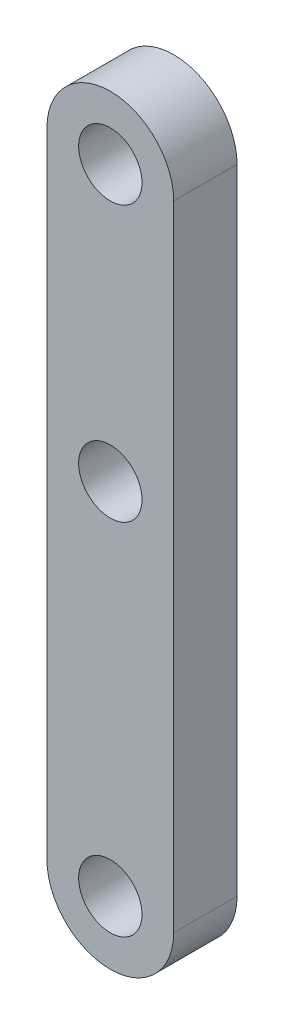
ISO-10303-21;
HEADER;
FILE_DESCRIPTION(('STEP AP214'),'2;1');
FILE_NAME('part.step','',(''),(''),'','','');
FILE_SCHEMA(('AUTOMOTIVE_DESIGN { 1 0 10303 214 1 1 1 1 }'));
ENDSEC;
DATA;
#1=APPLICATION_CONTEXT('core data for automotive mechanical design processes');
#2=APPLICATION_PROTOCOL_DEFINITION('international standard','automotive_design',2000,#1);
#3=PRODUCT_CONTEXT('',#1,'mechanical');
#4=PRODUCT('Part','Part','',(#3));
#5=PRODUCT_RELATED_PRODUCT_CATEGORY('part','',(#4));
#6=PRODUCT_DEFINITION_FORMATION('','',#4);
#7=PRODUCT_DEFINITION_CONTEXT('part definition',#1,'design');
#8=PRODUCT_DEFINITION('design','',#6,#7);
#9=PRODUCT_DEFINITION_SHAPE('','',#8);
#10=(LENGTH_UNIT() NAMED_UNIT(*) SI_UNIT(.MILLI.,.METRE.));
#11=(NAMED_UNIT(*) PLANE_ANGLE_UNIT() SI_UNIT($,.RADIAN.));
#12=(NAMED_UNIT(*) SI_UNIT($,.STERADIAN.) SOLID_ANGLE_UNIT());
#13=UNCERTAINTY_MEASURE_WITH_UNIT(LENGTH_MEASURE(1.E-05),#10,'distance_accuracy_value','');
#14=(GEOMETRIC_REPRESENTATION_CONTEXT(3) GLOBAL_UNCERTAINTY_ASSIGNED_CONTEXT((#13)) GLOBAL_UNIT_ASSIGNED_CONTEXT((#10,
#11,#12)) REPRESENTATION_CONTEXT('',''));
#15=CARTESIAN_POINT('',(0.,0.,0.));
#16=DIRECTION('',(0.,0.,1.));
#17=DIRECTION('',(1.,0.,0.));
#18=AXIS2_PLACEMENT_3D('',#15,#16,#17);
#19=CARTESIAN_POINT('',(0.,-30.,3.));
#20=DIRECTION('',(0.,0.,-1.));
#21=DIRECTION('',(-1.,0.,0.));
#22=AXIS2_PLACEMENT_3D('',#19,#20,#21);
#23=PLANE('',#22);
#24=DIRECTION('',(0.,1.,0.));
#25=VECTOR('',#24,1.);
#26=CARTESIAN_POINT('',(3.,-8.,3.));
#27=LINE('',#26,#25);
#28=CARTESIAN_POINT('',(3.,-30.,3.));
#29=VERTEX_POINT('',#28);
#30=CARTESIAN_POINT('',(3.,0.,3.));
#31=VERTEX_POINT('',#30);
#32=EDGE_CURVE('E50',#29,#31,#27,.T.);
#33=ORIENTED_EDGE('',*,*,#32,.T.);
#34=CARTESIAN_POINT('',(0.,0.,3.));
#35=DIRECTION('',(0.,0.,1.));
#36=DIRECTION('',(1.,0.,0.));
#37=AXIS2_PLACEMENT_3D('',#34,#35,#36);
#38=CIRCLE('',#37,3.);
#39=CARTESIAN_POINT('',(-3.,0.,3.));
#40=VERTEX_POINT('',#39);
#41=EDGE_CURVE('E80',#31,#40,#38,.T.);
#42=ORIENTED_EDGE('',*,*,#41,.T.);
#43=DIRECTION('',(0.,-1.,0.));
#44=VECTOR('',#43,1.);
#45=CARTESIAN_POINT('',(-3.,0.,3.));
#46=LINE('',#45,#44);
#47=CARTESIAN_POINT('',(-3.,-30.,3.));
#48=VERTEX_POINT('',#47);
#49=EDGE_CURVE('E84',#40,#48,#46,.T.);
#50=ORIENTED_EDGE('',*,*,#49,.T.);
#51=CARTESIAN_POINT('',(0.,-30.,3.));
#52=DIRECTION('',(0.,0.,1.));
#53=DIRECTION('',(-1.,0.,0.));
#54=AXIS2_PLACEMENT_3D('',#51,#52,#53);
#55=CIRCLE('',#54,3.);
#56=EDGE_CURVE('E92',#48,#29,#55,.T.);
#57=ORIENTED_EDGE('',*,*,#56,.T.);
#58=EDGE_LOOP('',(#33,#42,#50,#57));
#59=FACE_BOUND('',#58,.T.);
#60=CARTESIAN_POINT('',(0.,0.,3.));
#61=DIRECTION('',(0.,0.,1.));
#62=DIRECTION('',(1.,0.,0.));
#63=AXIS2_PLACEMENT_3D('',#60,#61,#62);
#64=CIRCLE('',#63,1.5);
#65=CARTESIAN_POINT('',(1.5,0.,3.));
#66=VERTEX_POINT('',#65);
#67=EDGE_CURVE('E99',#66,#66,#64,.T.);
#68=ORIENTED_EDGE('',*,*,#67,.F.);
#69=EDGE_LOOP('',(#68));
#70=FACE_BOUND('',#69,.T.);
#71=CARTESIAN_POINT('',(0.,-30.,3.));
#72=DIRECTION('',(0.,0.,1.));
#73=DIRECTION('',(-1.,0.,0.));
#74=AXIS2_PLACEMENT_3D('',#71,#72,#73);
#75=CIRCLE('',#74,1.5);
#76=CARTESIAN_POINT('',(-1.5,-30.,3.));
#77=VERTEX_POINT('',#76);
#78=EDGE_CURVE('E150',#77,#77,#75,.T.);
#79=ORIENTED_EDGE('',*,*,#78,.F.);
#80=EDGE_LOOP('',(#79));
#81=FACE_BOUND('',#80,.T.);
#82=CARTESIAN_POINT('',(0.,-13.,3.));
#83=DIRECTION('',(0.,0.,1.));
#84=DIRECTION('',(1.,0.,0.));
#85=AXIS2_PLACEMENT_3D('',#82,#83,#84);
#86=CIRCLE('',#85,1.5);
#87=CARTESIAN_POINT('',(1.5,-13.,3.));
#88=VERTEX_POINT('',#87);
#89=EDGE_CURVE('E141',#88,#88,#86,.T.);
#90=ORIENTED_EDGE('',*,*,#89,.F.);
#91=EDGE_LOOP('',(#90));
#92=FACE_BOUND('',#91,.T.);
#93=ADVANCED_FACE('F33',(#59,#70,#81,#92),#23,.F.);
#94=CARTESIAN_POINT('',(0.,-30.,0.));
#95=DIRECTION('',(0.,0.,-1.));
#96=DIRECTION('',(-1.,0.,0.));
#97=AXIS2_PLACEMENT_3D('',#94,#95,#96);
#98=PLANE('',#97);
#99=CARTESIAN_POINT('',(0.,-30.,0.));
#100=DIRECTION('',(0.,0.,1.));
#101=DIRECTION('',(-1.,0.,0.));
#102=AXIS2_PLACEMENT_3D('',#99,#100,#101);
#103=CIRCLE('',#102,1.5);
#104=CARTESIAN_POINT('',(-1.5,-30.,0.));
#105=VERTEX_POINT('',#104);
#106=EDGE_CURVE('E147',#105,#105,#103,.T.);
#107=ORIENTED_EDGE('',*,*,#106,.T.);
#108=EDGE_LOOP('',(#107));
#109=FACE_BOUND('',#108,.T.);
#110=CARTESIAN_POINT('',(0.,0.,0.));
#111=DIRECTION('',(0.,0.,1.));
#112=DIRECTION('',(1.,0.,0.));
#113=AXIS2_PLACEMENT_3D('',#110,#111,#112);
#114=CIRCLE('',#113,3.);
#115=CARTESIAN_POINT('',(3.,0.,0.));
#116=VERTEX_POINT('',#115);
#117=CARTESIAN_POINT('',(-3.,0.,0.));
#118=VERTEX_POINT('',#117);
#119=EDGE_CURVE('E88',#116,#118,#114,.T.);
#120=ORIENTED_EDGE('',*,*,#119,.F.);
#121=DIRECTION('',(0.,1.,0.));
#122=VECTOR('',#121,1.);
#123=CARTESIAN_POINT('',(3.,-12.,0.));
#124=LINE('',#123,#122);
#125=CARTESIAN_POINT('',(3.,-30.,0.));
#126=VERTEX_POINT('',#125);
#127=EDGE_CURVE('E102',#126,#116,#124,.T.);
#128=ORIENTED_EDGE('',*,*,#127,.F.);
#129=CARTESIAN_POINT('',(0.,-30.,0.));
#130=DIRECTION('',(0.,0.,1.));
#131=DIRECTION('',(-1.,0.,0.));
#132=AXIS2_PLACEMENT_3D('',#129,#130,#131);
#133=CIRCLE('',#132,3.);
#134=CARTESIAN_POINT('',(-3.,-30.,0.));
#135=VERTEX_POINT('',#134);
#136=EDGE_CURVE('E75',#135,#126,#133,.T.);
#137=ORIENTED_EDGE('',*,*,#136,.F.);
#138=DIRECTION('',(0.,-1.,0.));
#139=VECTOR('',#138,1.);
#140=CARTESIAN_POINT('',(-3.,0.,0.));
#141=LINE('',#140,#139);
#142=EDGE_CURVE('E68',#118,#135,#141,.T.);
#143=ORIENTED_EDGE('',*,*,#142,.F.);
#144=EDGE_LOOP('',(#120,#128,#137,#143));
#145=FACE_BOUND('',#144,.T.);
#146=CARTESIAN_POINT('',(0.,0.,0.));
#147=DIRECTION('',(0.,0.,1.));
#148=DIRECTION('',(1.,0.,0.));
#149=AXIS2_PLACEMENT_3D('',#146,#147,#148);
#150=CIRCLE('',#149,1.5);
#151=CARTESIAN_POINT('',(1.5,0.,0.));
#152=VERTEX_POINT('',#151);
#153=EDGE_CURVE('E153',#152,#152,#150,.T.);
#154=ORIENTED_EDGE('',*,*,#153,.T.);
#155=EDGE_LOOP('',(#154));
#156=FACE_BOUND('',#155,.T.);
#157=CARTESIAN_POINT('',(0.,-13.,0.));
#158=DIRECTION('',(0.,0.,1.));
#159=DIRECTION('',(1.,0.,0.));
#160=AXIS2_PLACEMENT_3D('',#157,#158,#159);
#161=CIRCLE('',#160,1.5);
#162=CARTESIAN_POINT('',(1.5,-13.,0.));
#163=VERTEX_POINT('',#162);
#164=EDGE_CURVE('E144',#163,#163,#161,.T.);
#165=ORIENTED_EDGE('',*,*,#164,.T.);
#166=EDGE_LOOP('',(#165));
#167=FACE_BOUND('',#166,.T.);
#168=ADVANCED_FACE('F108',(#109,#145,#156,#167),#98,.T.);
#169=CARTESIAN_POINT('',(0.,0.,3.));
#170=DIRECTION('',(0.,0.,-1.));
#171=DIRECTION('',(-1.,0.,0.));
#172=AXIS2_PLACEMENT_3D('',#169,#170,#171);
#173=CYLINDRICAL_SURFACE('',#172,3.);
#174=ORIENTED_EDGE('',*,*,#119,.T.);
#175=DIRECTION('',(0.,0.,-1.));
#176=VECTOR('',#175,1.);
#177=CARTESIAN_POINT('',(-3.,0.,3.));
#178=LINE('',#177,#176);
#179=EDGE_CURVE('E42',#40,#118,#178,.T.);
#180=ORIENTED_EDGE('',*,*,#179,.F.);
#181=ORIENTED_EDGE('',*,*,#41,.F.);
#182=DIRECTION('',(0.,0.,-1.));
#183=VECTOR('',#182,1.);
#184=CARTESIAN_POINT('',(3.,0.,3.));
#185=LINE('',#184,#183);
#186=EDGE_CURVE('E11',#31,#116,#185,.T.);
#187=ORIENTED_EDGE('',*,*,#186,.T.);
#188=EDGE_LOOP('',(#174,#180,#181,#187));
#189=FACE_BOUND('',#188,.T.);
#190=ADVANCED_FACE('F35',(#189),#173,.T.);
#191=CARTESIAN_POINT('',(-3.,0.,3.));
#192=DIRECTION('',(1.,0.,0.));
#193=DIRECTION('',(0.,1.,0.));
#194=AXIS2_PLACEMENT_3D('',#191,#192,#193);
#195=PLANE('',#194);
#196=ORIENTED_EDGE('',*,*,#142,.T.);
#197=DIRECTION('',(0.,0.,-1.));
#198=VECTOR('',#197,1.);
#199=CARTESIAN_POINT('',(-3.,-30.,3.));
#200=LINE('',#199,#198);
#201=EDGE_CURVE('E89',#48,#135,#200,.T.);
#202=ORIENTED_EDGE('',*,*,#201,.F.);
#203=ORIENTED_EDGE('',*,*,#49,.F.);
#204=ORIENTED_EDGE('',*,*,#179,.T.);
#205=EDGE_LOOP('',(#196,#202,#203,#204));
#206=FACE_BOUND('',#205,.T.);
#207=ADVANCED_FACE('F90',(#206),#195,.F.);
#208=CARTESIAN_POINT('',(0.,-30.,3.));
#209=DIRECTION('',(0.,0.,-1.));
#210=DIRECTION('',(-1.,0.,0.));
#211=AXIS2_PLACEMENT_3D('',#208,#209,#210);
#212=CYLINDRICAL_SURFACE('',#211,3.);
#213=ORIENTED_EDGE('',*,*,#136,.T.);
#214=DIRECTION('',(0.,0.,-1.));
#215=VECTOR('',#214,1.);
#216=CARTESIAN_POINT('',(3.,-30.,3.));
#217=LINE('',#216,#215);
#218=EDGE_CURVE('E94',#29,#126,#217,.T.);
#219=ORIENTED_EDGE('',*,*,#218,.F.);
#220=ORIENTED_EDGE('',*,*,#56,.F.);
#221=ORIENTED_EDGE('',*,*,#201,.T.);
#222=EDGE_LOOP('',(#213,#219,#220,#221));
#223=FACE_BOUND('',#222,.T.);
#224=ADVANCED_FACE('F105',(#223),#212,.T.);
#225=CARTESIAN_POINT('',(3.,-12.,3.));
#226=DIRECTION('',(-1.,0.,0.));
#227=DIRECTION('',(0.,-1.,0.));
#228=AXIS2_PLACEMENT_3D('',#225,#226,#227);
#229=PLANE('',#228);
#230=ORIENTED_EDGE('',*,*,#127,.T.);
#231=ORIENTED_EDGE('',*,*,#186,.F.);
#232=ORIENTED_EDGE('',*,*,#32,.F.);
#233=ORIENTED_EDGE('',*,*,#218,.T.);
#234=EDGE_LOOP('',(#230,#231,#232,#233));
#235=FACE_BOUND('',#234,.T.);
#236=ADVANCED_FACE('F110',(#235),#229,.F.);
#237=CARTESIAN_POINT('',(0.,0.,3.));
#238=DIRECTION('',(0.,0.,-1.));
#239=DIRECTION('',(-1.,0.,0.));
#240=AXIS2_PLACEMENT_3D('',#237,#238,#239);
#241=CYLINDRICAL_SURFACE('',#240,1.5);
#242=ORIENTED_EDGE('',*,*,#67,.T.);
#243=EDGE_LOOP('',(#242));
#244=FACE_BOUND('',#243,.T.);
#245=ORIENTED_EDGE('',*,*,#153,.F.);
#246=EDGE_LOOP('',(#245));
#247=FACE_BOUND('',#246,.T.);
#248=ADVANCED_FACE('F112',(#244,#247),#241,.F.);
#249=CARTESIAN_POINT('',(0.,-30.,3.));
#250=DIRECTION('',(0.,0.,-1.));
#251=DIRECTION('',(-1.,0.,0.));
#252=AXIS2_PLACEMENT_3D('',#249,#250,#251);
#253=CYLINDRICAL_SURFACE('',#252,1.5);
#254=ORIENTED_EDGE('',*,*,#78,.T.);
#255=EDGE_LOOP('',(#254));
#256=FACE_BOUND('',#255,.T.);
#257=ORIENTED_EDGE('',*,*,#106,.F.);
#258=EDGE_LOOP('',(#257));
#259=FACE_BOUND('',#258,.T.);
#260=ADVANCED_FACE('F118',(#256,#259),#253,.F.);
#261=CARTESIAN_POINT('',(0.,-13.,3.));
#262=DIRECTION('',(0.,0.,-1.));
#263=DIRECTION('',(-1.,0.,0.));
#264=AXIS2_PLACEMENT_3D('',#261,#262,#263);
#265=CYLINDRICAL_SURFACE('',#264,1.5);
#266=ORIENTED_EDGE('',*,*,#89,.T.);
#267=EDGE_LOOP('',(#266));
#268=FACE_BOUND('',#267,.T.);
#269=ORIENTED_EDGE('',*,*,#164,.F.);
#270=EDGE_LOOP('',(#269));
#271=FACE_BOUND('',#270,.T.);
#272=ADVANCED_FACE('F132',(#268,#271),#265,.F.);
#273=CLOSED_SHELL('',(#93,#168,#190,#207,#224,#236,#248,#260,#272));
#274=MANIFOLD_SOLID_BREP('B2',#273);
#275=ADVANCED_BREP_SHAPE_REPRESENTATION('',(#18,#274),#14);
#276=SHAPE_DEFINITION_REPRESENTATION(#9,#275);
ENDSEC;
END-ISO-10303-21;
